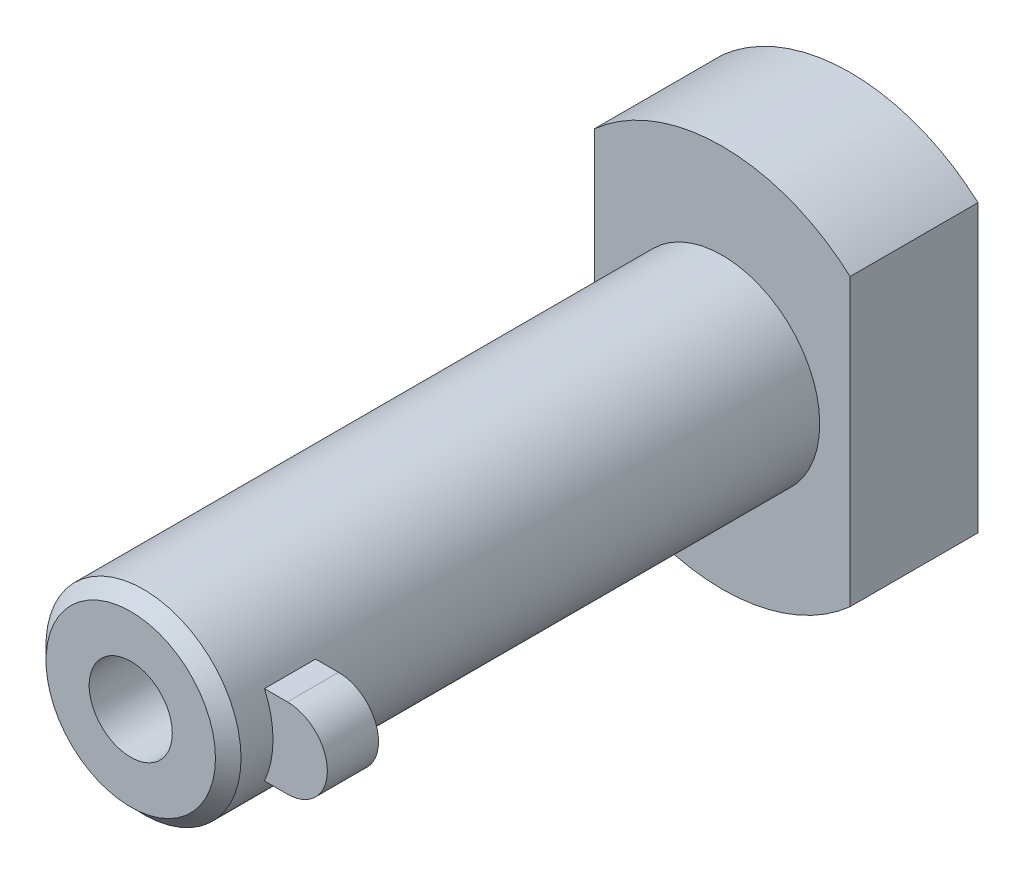
ISO-10303-21;
HEADER;
FILE_DESCRIPTION(('STEP AP214'),'2;1');
FILE_NAME('part.step','',(''),(''),'','','');
FILE_SCHEMA(('AUTOMOTIVE_DESIGN { 1 0 10303 214 1 1 1 1 }'));
ENDSEC;
DATA;
#1=APPLICATION_CONTEXT('core data for automotive mechanical design processes');
#2=APPLICATION_PROTOCOL_DEFINITION('international standard','automotive_design',2000,#1);
#3=PRODUCT_CONTEXT('',#1,'mechanical');
#4=PRODUCT('Part','Part','',(#3));
#5=PRODUCT_RELATED_PRODUCT_CATEGORY('part','',(#4));
#6=PRODUCT_DEFINITION_FORMATION('','',#4);
#7=PRODUCT_DEFINITION_CONTEXT('part definition',#1,'design');
#8=PRODUCT_DEFINITION('design','',#6,#7);
#9=PRODUCT_DEFINITION_SHAPE('','',#8);
#10=(LENGTH_UNIT() NAMED_UNIT(*) SI_UNIT(.MILLI.,.METRE.));
#11=(NAMED_UNIT(*) PLANE_ANGLE_UNIT() SI_UNIT($,.RADIAN.));
#12=(NAMED_UNIT(*) SI_UNIT($,.STERADIAN.) SOLID_ANGLE_UNIT());
#13=UNCERTAINTY_MEASURE_WITH_UNIT(LENGTH_MEASURE(1.E-05),#10,'distance_accuracy_value','');
#14=(GEOMETRIC_REPRESENTATION_CONTEXT(3) GLOBAL_UNCERTAINTY_ASSIGNED_CONTEXT((#13)) GLOBAL_UNIT_ASSIGNED_CONTEXT((#10,
#11,#12)) REPRESENTATION_CONTEXT('',''));
#15=CARTESIAN_POINT('',(0.,0.,0.));
#16=DIRECTION('',(0.,0.,1.));
#17=DIRECTION('',(1.,0.,0.));
#18=AXIS2_PLACEMENT_3D('',#15,#16,#17);
#19=CARTESIAN_POINT('',(0.,0.,4.));
#20=DIRECTION('',(0.,0.,-1.));
#21=DIRECTION('',(-1.,0.,0.));
#22=AXIS2_PLACEMENT_3D('',#19,#20,#21);
#23=CYLINDRICAL_SURFACE('',#22,6.);
#24=CARTESIAN_POINT('',(0.,0.,0.));
#25=DIRECTION('',(0.,0.,1.));
#26=DIRECTION('',(1.,0.,0.));
#27=AXIS2_PLACEMENT_3D('',#24,#25,#26);
#28=CIRCLE('',#27,6.);
#29=CARTESIAN_POINT('',(-4.,-4.47213595499958,0.));
#30=VERTEX_POINT('',#29);
#31=CARTESIAN_POINT('',(4.,-4.47213595499958,0.));
#32=VERTEX_POINT('',#31);
#33=EDGE_CURVE('E111',#30,#32,#28,.T.);
#34=ORIENTED_EDGE('',*,*,#33,.T.);
#35=DIRECTION('',(0.,0.,-1.));
#36=VECTOR('',#35,1.);
#37=CARTESIAN_POINT('',(4.,-4.47213595499958,4.));
#38=LINE('',#37,#36);
#39=CARTESIAN_POINT('',(4.,-4.47213595499958,4.));
#40=VERTEX_POINT('',#39);
#41=EDGE_CURVE('E144',#40,#32,#38,.T.);
#42=ORIENTED_EDGE('',*,*,#41,.F.);
#43=CARTESIAN_POINT('',(0.,0.,4.));
#44=DIRECTION('',(0.,0.,1.));
#45=DIRECTION('',(1.,0.,0.));
#46=AXIS2_PLACEMENT_3D('',#43,#44,#45);
#47=CIRCLE('',#46,6.);
#48=CARTESIAN_POINT('',(-4.,-4.47213595499958,4.));
#49=VERTEX_POINT('',#48);
#50=EDGE_CURVE('E145',#49,#40,#47,.T.);
#51=ORIENTED_EDGE('',*,*,#50,.F.);
#52=DIRECTION('',(0.,0.,-1.));
#53=VECTOR('',#52,1.);
#54=CARTESIAN_POINT('',(-4.,-4.47213595499958,4.));
#55=LINE('',#54,#53);
#56=EDGE_CURVE('E155',#49,#30,#55,.T.);
#57=ORIENTED_EDGE('',*,*,#56,.T.);
#58=EDGE_LOOP('',(#34,#42,#51,#57));
#59=FACE_BOUND('',#58,.T.);
#60=ADVANCED_FACE('F37',(#59),#23,.T.);
#61=CARTESIAN_POINT('',(4.,0.,4.));
#62=DIRECTION('',(1.,0.,0.));
#63=DIRECTION('',(0.,1.,0.));
#64=AXIS2_PLACEMENT_3D('',#61,#62,#63);
#65=PLANE('',#64);
#66=DIRECTION('',(0.,-1.,0.));
#67=VECTOR('',#66,1.);
#68=CARTESIAN_POINT('',(4.,0.,0.));
#69=LINE('',#68,#67);
#70=CARTESIAN_POINT('',(4.,4.47213595499958,0.));
#71=VERTEX_POINT('',#70);
#72=EDGE_CURVE('E158',#71,#32,#69,.T.);
#73=ORIENTED_EDGE('',*,*,#72,.F.);
#74=DIRECTION('',(0.,0.,-1.));
#75=VECTOR('',#74,1.);
#76=CARTESIAN_POINT('',(4.,4.47213595499958,4.));
#77=LINE('',#76,#75);
#78=CARTESIAN_POINT('',(4.,4.47213595499958,4.));
#79=VERTEX_POINT('',#78);
#80=EDGE_CURVE('E167',#79,#71,#77,.T.);
#81=ORIENTED_EDGE('',*,*,#80,.F.);
#82=DIRECTION('',(0.,-1.,0.));
#83=VECTOR('',#82,1.);
#84=CARTESIAN_POINT('',(4.,0.,4.));
#85=LINE('',#84,#83);
#86=EDGE_CURVE('E147',#79,#40,#85,.T.);
#87=ORIENTED_EDGE('',*,*,#86,.T.);
#88=ORIENTED_EDGE('',*,*,#41,.T.);
#89=EDGE_LOOP('',(#73,#81,#87,#88));
#90=FACE_BOUND('',#89,.T.);
#91=ADVANCED_FACE('F186',(#90),#65,.T.);
#92=CARTESIAN_POINT('',(-4.,4.47213595499958,0.));
#93=VERTEX_POINT('',#92);
#94=EDGE_CURVE('E159',#71,#93,#28,.T.);
#95=ORIENTED_EDGE('',*,*,#94,.T.);
#96=DIRECTION('',(0.,0.,-1.));
#97=VECTOR('',#96,1.);
#98=CARTESIAN_POINT('',(-4.,4.47213595499958,4.));
#99=LINE('',#98,#97);
#100=CARTESIAN_POINT('',(-4.,4.47213595499958,4.));
#101=VERTEX_POINT('',#100);
#102=EDGE_CURVE('E165',#101,#93,#99,.T.);
#103=ORIENTED_EDGE('',*,*,#102,.F.);
#104=EDGE_CURVE('E149',#79,#101,#47,.T.);
#105=ORIENTED_EDGE('',*,*,#104,.F.);
#106=ORIENTED_EDGE('',*,*,#80,.T.);
#107=EDGE_LOOP('',(#95,#103,#105,#106));
#108=FACE_BOUND('',#107,.T.);
#109=ADVANCED_FACE('F189',(#108),#23,.T.);
#110=CARTESIAN_POINT('',(-4.,0.,4.));
#111=DIRECTION('',(-1.,0.,0.));
#112=DIRECTION('',(0.,0.,1.));
#113=AXIS2_PLACEMENT_3D('',#110,#111,#112);
#114=PLANE('',#113);
#115=DIRECTION('',(0.,1.,0.));
#116=VECTOR('',#115,1.);
#117=CARTESIAN_POINT('',(-4.,0.,0.));
#118=LINE('',#117,#116);
#119=EDGE_CURVE('E148',#30,#93,#118,.T.);
#120=ORIENTED_EDGE('',*,*,#119,.F.);
#121=ORIENTED_EDGE('',*,*,#56,.F.);
#122=DIRECTION('',(0.,1.,0.));
#123=VECTOR('',#122,1.);
#124=CARTESIAN_POINT('',(-4.,0.,4.));
#125=LINE('',#124,#123);
#126=EDGE_CURVE('E152',#49,#101,#125,.T.);
#127=ORIENTED_EDGE('',*,*,#126,.T.);
#128=ORIENTED_EDGE('',*,*,#102,.T.);
#129=EDGE_LOOP('',(#120,#121,#127,#128));
#130=FACE_BOUND('',#129,.T.);
#131=ADVANCED_FACE('F196',(#130),#114,.T.);
#132=CARTESIAN_POINT('',(0.,0.,4.));
#133=DIRECTION('',(0.,0.,1.));
#134=DIRECTION('',(1.,0.,0.));
#135=AXIS2_PLACEMENT_3D('',#132,#133,#134);
#136=PLANE('',#135);
#137=CARTESIAN_POINT('',(0.,0.,4.));
#138=DIRECTION('',(0.,0.,1.));
#139=DIRECTION('',(1.,0.,0.));
#140=AXIS2_PLACEMENT_3D('',#137,#138,#139);
#141=CIRCLE('',#140,3.05);
#142=CARTESIAN_POINT('',(3.05,0.,4.));
#143=VERTEX_POINT('',#142);
#144=EDGE_CURVE('E141',#143,#143,#141,.T.);
#145=ORIENTED_EDGE('',*,*,#144,.F.);
#146=EDGE_LOOP('',(#145));
#147=FACE_BOUND('',#146,.T.);
#148=ORIENTED_EDGE('',*,*,#50,.T.);
#149=ORIENTED_EDGE('',*,*,#86,.F.);
#150=ORIENTED_EDGE('',*,*,#104,.T.);
#151=ORIENTED_EDGE('',*,*,#126,.F.);
#152=EDGE_LOOP('',(#148,#149,#150,#151));
#153=FACE_BOUND('',#152,.T.);
#154=ADVANCED_FACE('F201',(#147,#153),#136,.T.);
#155=CARTESIAN_POINT('',(0.,0.,0.));
#156=DIRECTION('',(0.,0.,1.));
#157=DIRECTION('',(1.,0.,0.));
#158=AXIS2_PLACEMENT_3D('',#155,#156,#157);
#159=PLANE('',#158);
#160=CARTESIAN_POINT('',(0.,0.,0.));
#161=DIRECTION('',(0.,0.,1.));
#162=DIRECTION('',(1.,0.,0.));
#163=AXIS2_PLACEMENT_3D('',#160,#161,#162);
#164=CIRCLE('',#163,1.3);
#165=CARTESIAN_POINT('',(1.3,0.,0.));
#166=VERTEX_POINT('',#165);
#167=EDGE_CURVE('E132',#166,#166,#164,.F.);
#168=ORIENTED_EDGE('',*,*,#167,.F.);
#169=EDGE_LOOP('',(#168));
#170=FACE_BOUND('',#169,.T.);
#171=ORIENTED_EDGE('',*,*,#33,.F.);
#172=ORIENTED_EDGE('',*,*,#119,.T.);
#173=ORIENTED_EDGE('',*,*,#94,.F.);
#174=ORIENTED_EDGE('',*,*,#72,.T.);
#175=EDGE_LOOP('',(#171,#172,#173,#174));
#176=FACE_BOUND('',#175,.T.);
#177=ADVANCED_FACE('F211',(#170,#176),#159,.F.);
#178=CARTESIAN_POINT('',(0.,0.,22.5));
#179=DIRECTION('',(0.,0.,-1.));
#180=DIRECTION('',(-1.,0.,0.));
#181=AXIS2_PLACEMENT_3D('',#178,#179,#180);
#182=CYLINDRICAL_SURFACE('',#181,3.05);
#183=CARTESIAN_POINT('',(0.,0.,22.1));
#184=DIRECTION('',(0.,0.,1.));
#185=DIRECTION('',(1.,0.,0.));
#186=AXIS2_PLACEMENT_3D('',#183,#184,#185);
#187=CIRCLE('',#186,3.05);
#188=CARTESIAN_POINT('',(3.05,0.,22.1));
#189=VERTEX_POINT('',#188);
#190=EDGE_CURVE('E11',#189,#189,#187,.F.);
#191=ORIENTED_EDGE('',*,*,#190,.T.);
#192=EDGE_LOOP('',(#191));
#193=FACE_BOUND('',#192,.T.);
#194=DIRECTION('',(0.,0.,-1.));
#195=VECTOR('',#194,1.);
#196=CARTESIAN_POINT('',(2.78208554864871,-1.25,21.1));
#197=LINE('',#196,#195);
#198=CARTESIAN_POINT('',(2.78208554864871,-1.25,21.1));
#199=VERTEX_POINT('',#198);
#200=CARTESIAN_POINT('',(2.78208554864871,-1.25,19.5));
#201=VERTEX_POINT('',#200);
#202=EDGE_CURVE('E58',#199,#201,#197,.T.);
#203=ORIENTED_EDGE('',*,*,#202,.F.);
#204=CARTESIAN_POINT('',(0.,0.,21.1));
#205=DIRECTION('',(0.,0.,1.));
#206=DIRECTION('',(1.,0.,0.));
#207=AXIS2_PLACEMENT_3D('',#204,#205,#206);
#208=CIRCLE('',#207,3.05);
#209=CARTESIAN_POINT('',(2.78208554864871,1.25,21.1));
#210=VERTEX_POINT('',#209);
#211=EDGE_CURVE('E53',#210,#199,#208,.F.);
#212=ORIENTED_EDGE('',*,*,#211,.F.);
#213=DIRECTION('',(0.,0.,-1.));
#214=VECTOR('',#213,1.);
#215=CARTESIAN_POINT('',(2.78208554864871,1.25,21.1));
#216=LINE('',#215,#214);
#217=CARTESIAN_POINT('',(2.78208554864871,1.25,19.5));
#218=VERTEX_POINT('',#217);
#219=EDGE_CURVE('E112',#210,#218,#216,.T.);
#220=ORIENTED_EDGE('',*,*,#219,.T.);
#221=CARTESIAN_POINT('',(0.,0.,19.5));
#222=DIRECTION('',(0.,0.,1.));
#223=DIRECTION('',(1.,0.,0.));
#224=AXIS2_PLACEMENT_3D('',#221,#222,#223);
#225=CIRCLE('',#224,3.05);
#226=EDGE_CURVE('E134',#218,#201,#225,.F.);
#227=ORIENTED_EDGE('',*,*,#226,.T.);
#228=EDGE_LOOP('',(#203,#212,#220,#227));
#229=FACE_BOUND('',#228,.T.);
#230=ORIENTED_EDGE('',*,*,#144,.T.);
#231=EDGE_LOOP('',(#230));
#232=FACE_BOUND('',#231,.T.);
#233=ADVANCED_FACE('F223',(#193,#229,#232),#182,.T.);
#234=CARTESIAN_POINT('',(0.,0.,22.5));
#235=DIRECTION('',(0.,0.,1.));
#236=DIRECTION('',(1.,0.,0.));
#237=AXIS2_PLACEMENT_3D('',#234,#235,#236);
#238=PLANE('',#237);
#239=CARTESIAN_POINT('',(0.,0.,22.5));
#240=DIRECTION('',(0.,0.,1.));
#241=DIRECTION('',(1.,0.,0.));
#242=AXIS2_PLACEMENT_3D('',#239,#240,#241);
#243=CIRCLE('',#242,2.65);
#244=CARTESIAN_POINT('',(2.65,0.,22.5));
#245=VERTEX_POINT('',#244);
#246=EDGE_CURVE('E46',#245,#245,#243,.T.);
#247=ORIENTED_EDGE('',*,*,#246,.T.);
#248=EDGE_LOOP('',(#247));
#249=FACE_BOUND('',#248,.T.);
#250=CARTESIAN_POINT('',(0.,0.,22.5));
#251=DIRECTION('',(0.,0.,1.));
#252=DIRECTION('',(1.,0.,0.));
#253=AXIS2_PLACEMENT_3D('',#250,#251,#252);
#254=CIRCLE('',#253,1.3);
#255=CARTESIAN_POINT('',(1.3,0.,22.5));
#256=VERTEX_POINT('',#255);
#257=EDGE_CURVE('E339',#256,#256,#254,.T.);
#258=ORIENTED_EDGE('',*,*,#257,.F.);
#259=EDGE_LOOP('',(#258));
#260=FACE_BOUND('',#259,.T.);
#261=ADVANCED_FACE('F172',(#249,#260),#238,.T.);
#262=CARTESIAN_POINT('',(3.5,0.,21.1));
#263=DIRECTION('',(0.,0.,-1.));
#264=DIRECTION('',(-1.,0.,0.));
#265=AXIS2_PLACEMENT_3D('',#262,#263,#264);
#266=CYLINDRICAL_SURFACE('',#265,1.25);
#267=CARTESIAN_POINT('',(3.5,0.,19.5));
#268=DIRECTION('',(0.,0.,1.));
#269=DIRECTION('',(1.,0.,0.));
#270=AXIS2_PLACEMENT_3D('',#267,#268,#269);
#271=CIRCLE('',#270,1.25);
#272=CARTESIAN_POINT('',(3.5,1.25,19.5));
#273=VERTEX_POINT('',#272);
#274=CARTESIAN_POINT('',(3.5,-1.25,19.5));
#275=VERTEX_POINT('',#274);
#276=EDGE_CURVE('E106',#273,#275,#271,.F.);
#277=ORIENTED_EDGE('',*,*,#276,.F.);
#278=DIRECTION('',(0.,0.,-1.));
#279=VECTOR('',#278,1.);
#280=CARTESIAN_POINT('',(3.5,1.25,21.1));
#281=LINE('',#280,#279);
#282=CARTESIAN_POINT('',(3.5,1.25,21.1));
#283=VERTEX_POINT('',#282);
#284=EDGE_CURVE('E101',#283,#273,#281,.T.);
#285=ORIENTED_EDGE('',*,*,#284,.F.);
#286=CARTESIAN_POINT('',(3.5,0.,21.1));
#287=DIRECTION('',(0.,0.,1.));
#288=DIRECTION('',(1.,0.,0.));
#289=AXIS2_PLACEMENT_3D('',#286,#287,#288);
#290=CIRCLE('',#289,1.25);
#291=CARTESIAN_POINT('',(3.5,-1.25,21.1));
#292=VERTEX_POINT('',#291);
#293=EDGE_CURVE('E104',#283,#292,#290,.F.);
#294=ORIENTED_EDGE('',*,*,#293,.T.);
#295=DIRECTION('',(0.,0.,-1.));
#296=VECTOR('',#295,1.);
#297=CARTESIAN_POINT('',(3.5,-1.25,21.1));
#298=LINE('',#297,#296);
#299=EDGE_CURVE('E129',#292,#275,#298,.T.);
#300=ORIENTED_EDGE('',*,*,#299,.T.);
#301=EDGE_LOOP('',(#277,#285,#294,#300));
#302=FACE_BOUND('',#301,.T.);
#303=ADVANCED_FACE('F103',(#302),#266,.T.);
#304=CARTESIAN_POINT('',(0.,1.25,21.1));
#305=DIRECTION('',(0.,1.,0.));
#306=DIRECTION('',(-1.,0.,0.));
#307=AXIS2_PLACEMENT_3D('',#304,#305,#306);
#308=PLANE('',#307);
#309=DIRECTION('',(1.,0.,0.));
#310=VECTOR('',#309,1.);
#311=CARTESIAN_POINT('',(0.,1.25,19.5));
#312=LINE('',#311,#310);
#313=EDGE_CURVE('E131',#218,#273,#312,.T.);
#314=ORIENTED_EDGE('',*,*,#313,.F.);
#315=ORIENTED_EDGE('',*,*,#219,.F.);
#316=DIRECTION('',(1.,0.,0.));
#317=VECTOR('',#316,1.);
#318=CARTESIAN_POINT('',(0.,1.25,21.1));
#319=LINE('',#318,#317);
#320=EDGE_CURVE('E117',#210,#283,#319,.T.);
#321=ORIENTED_EDGE('',*,*,#320,.T.);
#322=ORIENTED_EDGE('',*,*,#284,.T.);
#323=EDGE_LOOP('',(#314,#315,#321,#322));
#324=FACE_BOUND('',#323,.T.);
#325=ADVANCED_FACE('F123',(#324),#308,.T.);
#326=CARTESIAN_POINT('',(0.,-1.25,21.1));
#327=DIRECTION('',(0.,1.,0.));
#328=DIRECTION('',(-1.,0.,0.));
#329=AXIS2_PLACEMENT_3D('',#326,#327,#328);
#330=PLANE('',#329);
#331=DIRECTION('',(1.,0.,0.));
#332=VECTOR('',#331,1.);
#333=CARTESIAN_POINT('',(0.,-1.25,19.5));
#334=LINE('',#333,#332);
#335=EDGE_CURVE('E121',#201,#275,#334,.T.);
#336=ORIENTED_EDGE('',*,*,#335,.T.);
#337=ORIENTED_EDGE('',*,*,#299,.F.);
#338=DIRECTION('',(1.,0.,0.));
#339=VECTOR('',#338,1.);
#340=CARTESIAN_POINT('',(0.,-1.25,21.1));
#341=LINE('',#340,#339);
#342=EDGE_CURVE('E119',#199,#292,#341,.T.);
#343=ORIENTED_EDGE('',*,*,#342,.F.);
#344=ORIENTED_EDGE('',*,*,#202,.T.);
#345=EDGE_LOOP('',(#336,#337,#343,#344));
#346=FACE_BOUND('',#345,.T.);
#347=ADVANCED_FACE('F237',(#346),#330,.F.);
#348=CARTESIAN_POINT('',(0.,0.,21.1));
#349=DIRECTION('',(0.,0.,1.));
#350=DIRECTION('',(1.,0.,0.));
#351=AXIS2_PLACEMENT_3D('',#348,#349,#350);
#352=PLANE('',#351);
#353=ORIENTED_EDGE('',*,*,#293,.F.);
#354=ORIENTED_EDGE('',*,*,#320,.F.);
#355=ORIENTED_EDGE('',*,*,#211,.T.);
#356=ORIENTED_EDGE('',*,*,#342,.T.);
#357=EDGE_LOOP('',(#353,#354,#355,#356));
#358=FACE_BOUND('',#357,.T.);
#359=ADVANCED_FACE('F116',(#358),#352,.T.);
#360=CARTESIAN_POINT('',(0.,0.,19.5));
#361=DIRECTION('',(0.,0.,1.));
#362=DIRECTION('',(1.,0.,0.));
#363=AXIS2_PLACEMENT_3D('',#360,#361,#362);
#364=PLANE('',#363);
#365=ORIENTED_EDGE('',*,*,#276,.T.);
#366=ORIENTED_EDGE('',*,*,#335,.F.);
#367=ORIENTED_EDGE('',*,*,#226,.F.);
#368=ORIENTED_EDGE('',*,*,#313,.T.);
#369=EDGE_LOOP('',(#365,#366,#367,#368));
#370=FACE_BOUND('',#369,.T.);
#371=ADVANCED_FACE('F181',(#370),#364,.F.);
#372=CARTESIAN_POINT('',(0.,0.,-0.001000000000001));
#373=DIRECTION('',(0.,0.,1.));
#374=DIRECTION('',(1.,0.,0.));
#375=AXIS2_PLACEMENT_3D('',#372,#373,#374);
#376=CYLINDRICAL_SURFACE('',#375,1.3);
#377=CARTESIAN_POINT('',(1.3,0.,22.5));
#378=CARTESIAN_POINT('',(1.3,0.,22.265625));
#379=CARTESIAN_POINT('',(1.3,0.,22.03125));
#380=CARTESIAN_POINT('',(1.3,0.,21.5625));
#381=CARTESIAN_POINT('',(1.3,0.,21.328125));
#382=CARTESIAN_POINT('',(1.3,0.,20.859375));
#383=CARTESIAN_POINT('',(1.3,0.,20.625));
#384=CARTESIAN_POINT('',(1.3,0.,20.15625));
#385=CARTESIAN_POINT('',(1.3,0.,19.921875));
#386=CARTESIAN_POINT('',(1.3,0.,19.453125));
#387=CARTESIAN_POINT('',(1.3,0.,19.21875));
#388=CARTESIAN_POINT('',(1.3,0.,18.75));
#389=CARTESIAN_POINT('',(1.3,0.,18.515625));
#390=CARTESIAN_POINT('',(1.3,0.,18.046875));
#391=CARTESIAN_POINT('',(1.3,0.,17.8125));
#392=CARTESIAN_POINT('',(1.3,0.,17.34375));
#393=CARTESIAN_POINT('',(1.3,0.,17.109375));
#394=CARTESIAN_POINT('',(1.3,0.,16.640625));
#395=CARTESIAN_POINT('',(1.3,0.,16.40625));
#396=CARTESIAN_POINT('',(1.3,0.,15.9375));
#397=CARTESIAN_POINT('',(1.3,0.,15.703125));
#398=CARTESIAN_POINT('',(1.3,0.,15.234375));
#399=CARTESIAN_POINT('',(1.3,0.,15.));
#400=CARTESIAN_POINT('',(1.3,0.,14.53125));
#401=CARTESIAN_POINT('',(1.3,0.,14.296875));
#402=CARTESIAN_POINT('',(1.3,0.,13.828125));
#403=CARTESIAN_POINT('',(1.3,0.,13.59375));
#404=CARTESIAN_POINT('',(1.3,0.,13.125));
#405=CARTESIAN_POINT('',(1.3,0.,12.890625));
#406=CARTESIAN_POINT('',(1.3,0.,12.421875));
#407=CARTESIAN_POINT('',(1.3,0.,12.1875));
#408=CARTESIAN_POINT('',(1.3,0.,11.71875));
#409=CARTESIAN_POINT('',(1.3,0.,11.484375));
#410=CARTESIAN_POINT('',(1.3,0.,11.015625));
#411=CARTESIAN_POINT('',(1.3,0.,10.78125));
#412=CARTESIAN_POINT('',(1.3,0.,10.3125));
#413=CARTESIAN_POINT('',(1.3,0.,10.078125));
#414=CARTESIAN_POINT('',(1.3,0.,9.609375));
#415=CARTESIAN_POINT('',(1.3,0.,9.375));
#416=CARTESIAN_POINT('',(1.3,0.,8.90625));
#417=CARTESIAN_POINT('',(1.3,0.,8.671875));
#418=CARTESIAN_POINT('',(1.3,0.,8.203125));
#419=CARTESIAN_POINT('',(1.3,0.,7.96875));
#420=CARTESIAN_POINT('',(1.3,0.,7.5));
#421=CARTESIAN_POINT('',(1.3,0.,7.265625));
#422=CARTESIAN_POINT('',(1.3,0.,6.796875));
#423=CARTESIAN_POINT('',(1.3,0.,6.5625));
#424=CARTESIAN_POINT('',(1.3,0.,6.09375));
#425=CARTESIAN_POINT('',(1.3,0.,5.859375));
#426=CARTESIAN_POINT('',(1.3,0.,5.390625));
#427=CARTESIAN_POINT('',(1.3,0.,5.15625));
#428=CARTESIAN_POINT('',(1.3,0.,4.6875));
#429=CARTESIAN_POINT('',(1.3,0.,4.453125));
#430=CARTESIAN_POINT('',(1.3,0.,3.984375));
#431=CARTESIAN_POINT('',(1.3,0.,3.75));
#432=CARTESIAN_POINT('',(1.3,0.,3.28125));
#433=CARTESIAN_POINT('',(1.3,0.,3.046875));
#434=CARTESIAN_POINT('',(1.3,0.,2.578125));
#435=CARTESIAN_POINT('',(1.3,0.,2.34375));
#436=CARTESIAN_POINT('',(1.3,0.,1.875));
#437=CARTESIAN_POINT('',(1.3,0.,1.640625));
#438=CARTESIAN_POINT('',(1.3,0.,1.171875));
#439=CARTESIAN_POINT('',(1.3,0.,0.937499999999999));
#440=CARTESIAN_POINT('',(1.3,0.,0.468749999999999));
#441=CARTESIAN_POINT('',(1.3,0.,0.234375));
#442=CARTESIAN_POINT('',(1.3,0.,0.));
#443=B_SPLINE_CURVE_WITH_KNOTS('',3,(#377,#378,#379,#380,#381,#382,#383,#384,#385,#386,#387,
#388,#389,#390,#391,#392,#393,#394,#395,#396,#397,#398,#399,#400,#401,#402,#403,#404,#405,#406,
#407,#408,#409,#410,#411,#412,#413,#414,#415,#416,#417,#418,#419,#420,#421,#422,#423,#424,#425,
#426,#427,#428,#429,#430,#431,#432,#433,#434,#435,#436,#437,#438,#439,#440,#441,#442),
.UNSPECIFIED.,.F.,.F.,(4,2,2,2,2,2,2,2,2,2,2,2,2,2,2,2,2,2,2,2,2,2,2,2,2,2,2,2,2,2,2,2,4),(0.,
0.703124999999999,1.40625,2.109375,2.8125,3.515625,4.21875,4.921875,5.625,6.328125,7.03125,
7.734375,8.4375,9.140625,9.84375,10.546875,11.25,11.953125,12.65625,13.359375,14.0625,14.765625,
15.46875,16.171875,16.875,17.578125,18.28125,18.984375,19.6875,20.390625,21.09375,21.796875,
22.5),.UNSPECIFIED.);
#444=EDGE_CURVE('BSEAM176',#256,#166,#443,.T.);
#445=ORIENTED_EDGE('',*,*,#257,.T.);
#446=ORIENTED_EDGE('',*,*,#167,.T.);
#447=ORIENTED_EDGE('',*,*,#444,.T.);
#448=ORIENTED_EDGE('',*,*,#444,.F.);
#449=EDGE_LOOP('',(#445,#447,#446,#448));
#450=FACE_BOUND('',#449,.T.);
#451=ADVANCED_FACE('F176',(#450),#376,.F.);
#452=CARTESIAN_POINT('',(0.,0.,22.5));
#453=DIRECTION('',(0.,0.,-1.));
#454=DIRECTION('',(-1.,0.,0.));
#455=AXIS2_PLACEMENT_3D('',#452,#453,#454);
#456=CONICAL_SURFACE('',#455,2.65,0.785398163397447);
#457=ORIENTED_EDGE('',*,*,#190,.F.);
#458=EDGE_LOOP('',(#457));
#459=FACE_BOUND('',#458,.T.);
#460=ORIENTED_EDGE('',*,*,#246,.F.);
#461=EDGE_LOOP('',(#460));
#462=FACE_BOUND('',#461,.T.);
#463=ADVANCED_FACE('F40',(#459,#462),#456,.T.);
#464=CLOSED_SHELL('',(#60,#91,#109,#131,#154,#177,#233,#261,#303,#325,#347,#359,#371,#451,#463));
#465=MANIFOLD_SOLID_BREP('B2',#464);
#466=ADVANCED_BREP_SHAPE_REPRESENTATION('',(#18,#465),#14);
#467=SHAPE_DEFINITION_REPRESENTATION(#9,#466);
ENDSEC;
END-ISO-10303-21;
